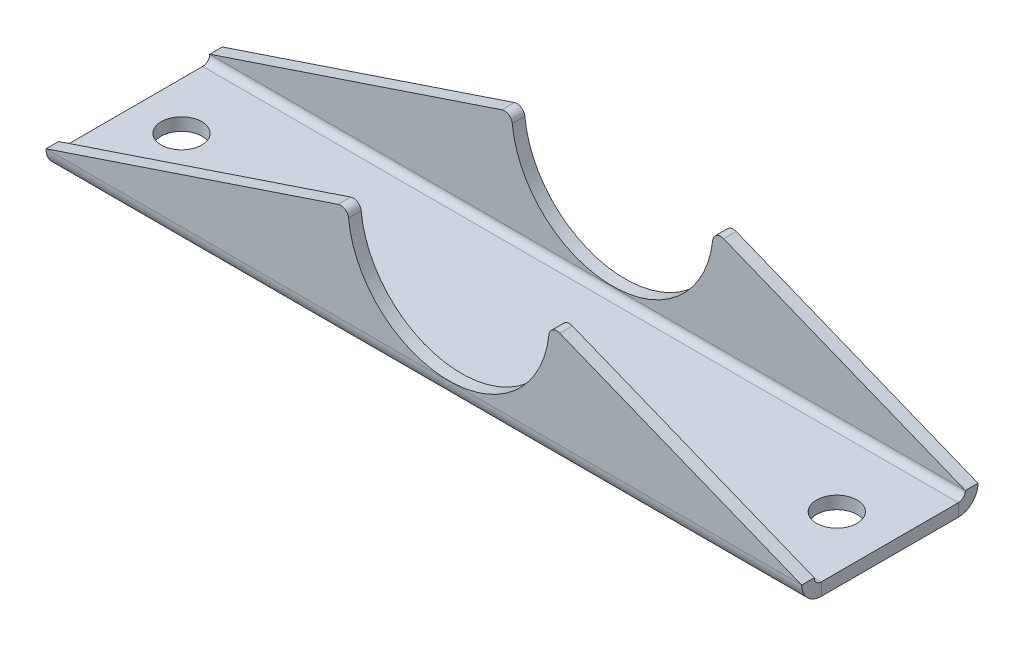
ISO-10303-21;
HEADER;
FILE_DESCRIPTION(('STEP AP214'),'2;1');
FILE_NAME('part.step','',(''),(''),'','','');
FILE_SCHEMA(('AUTOMOTIVE_DESIGN { 1 0 10303 214 1 1 1 1 }'));
ENDSEC;
DATA;
#1=APPLICATION_CONTEXT('core data for automotive mechanical design processes');
#2=APPLICATION_PROTOCOL_DEFINITION('international standard','automotive_design',2000,#1);
#3=PRODUCT_CONTEXT('',#1,'mechanical');
#4=PRODUCT('Part','Part','',(#3));
#5=PRODUCT_RELATED_PRODUCT_CATEGORY('part','',(#4));
#6=PRODUCT_DEFINITION_FORMATION('','',#4);
#7=PRODUCT_DEFINITION_CONTEXT('part definition',#1,'design');
#8=PRODUCT_DEFINITION('design','',#6,#7);
#9=PRODUCT_DEFINITION_SHAPE('','',#8);
#10=(LENGTH_UNIT() NAMED_UNIT(*) SI_UNIT(.MILLI.,.METRE.));
#11=(NAMED_UNIT(*) PLANE_ANGLE_UNIT() SI_UNIT($,.RADIAN.));
#12=(NAMED_UNIT(*) SI_UNIT($,.STERADIAN.) SOLID_ANGLE_UNIT());
#13=UNCERTAINTY_MEASURE_WITH_UNIT(LENGTH_MEASURE(1.E-05),#10,'distance_accuracy_value','');
#14=(GEOMETRIC_REPRESENTATION_CONTEXT(3) GLOBAL_UNCERTAINTY_ASSIGNED_CONTEXT((#13)) GLOBAL_UNIT_ASSIGNED_CONTEXT((#10,
#11,#12)) REPRESENTATION_CONTEXT('',''));
#15=CARTESIAN_POINT('',(0.,0.,0.));
#16=DIRECTION('',(0.,0.,1.));
#17=DIRECTION('',(1.,0.,0.));
#18=AXIS2_PLACEMENT_3D('',#15,#16,#17);
#19=CARTESIAN_POINT('',(0.,0.,11.1125));
#20=DIRECTION('',(0.,0.,-1.));
#21=DIRECTION('',(-1.,0.,0.));
#22=AXIS2_PLACEMENT_3D('',#19,#20,#21);
#23=PLANE('',#22);
#24=CARTESIAN_POINT('',(3.14739827064426,13.6525,11.1125));
#25=DIRECTION('',(0.,0.,1.));
#26=DIRECTION('',(1.,0.,0.));
#27=AXIS2_PLACEMENT_3D('',#24,#25,#26);
#28=CIRCLE('',#27,12.7);
#29=CARTESIAN_POINT('',(-9.48921957976562,12.385263122892,11.1125));
#30=VERTEX_POINT('',#29);
#31=CARTESIAN_POINT('',(15.7762175173427,12.3097697835311,11.1125));
#32=VERTEX_POINT('',#31);
#33=EDGE_CURVE('E322',#30,#32,#28,.T.);
#34=ORIENTED_EDGE('',*,*,#33,.F.);
#35=CARTESIAN_POINT('',(-10.4842288593254,12.2854806916236,11.1125));
#36=DIRECTION('',(0.,0.,-1.));
#37=DIRECTION('',(-1.,0.,0.));
#38=AXIS2_PLACEMENT_3D('',#35,#36,#37);
#39=CIRCLE('',#38,1.);
#40=CARTESIAN_POINT('',(-10.8020856125828,13.2336194390697,11.1125));
#41=VERTEX_POINT('',#40);
#42=EDGE_CURVE('E349',#30,#41,#39,.F.);
#43=ORIENTED_EDGE('',*,*,#42,.T.);
#44=DIRECTION('',(0.948138747446112,0.317856753257371,0.));
#45=VECTOR('',#44,1.);
#46=CARTESIAN_POINT('',(-5.07961258320421,15.1520377113116,11.1125));
#47=LINE('',#46,#45);
#48=CARTESIAN_POINT('',(-47.625,0.888999999999997,11.1125));
#49=VERTEX_POINT('',#48);
#50=EDGE_CURVE('E369',#49,#41,#47,.T.);
#51=ORIENTED_EDGE('',*,*,#50,.F.);
#52=DIRECTION('',(-1.,0.,0.));
#53=VECTOR('',#52,1.);
#54=CARTESIAN_POINT('',(0.,0.888999999999997,11.1125));
#55=LINE('',#54,#53);
#56=CARTESIAN_POINT('',(47.625,0.888999999999997,11.1125));
#57=VERTEX_POINT('',#56);
#58=EDGE_CURVE('E282',#57,#49,#55,.T.);
#59=ORIENTED_EDGE('',*,*,#58,.F.);
#60=DIRECTION('',(-0.927947517123265,0.372710887236701,0.));
#61=VECTOR('',#60,1.);
#62=CARTESIAN_POINT('',(6.92321704586757,17.2369047651089,11.1125));
#63=LINE('',#62,#61);
#64=CARTESIAN_POINT('',(17.1433236208549,13.131990511956,11.1125));
#65=VERTEX_POINT('',#64);
#66=EDGE_CURVE('E386',#57,#65,#63,.T.);
#67=ORIENTED_EDGE('',*,*,#66,.T.);
#68=CARTESIAN_POINT('',(16.7706127336182,12.2040429948327,11.1125));
#69=DIRECTION('',(0.,0.,-1.));
#70=DIRECTION('',(-1.,0.,0.));
#71=AXIS2_PLACEMENT_3D('',#68,#69,#70);
#72=CIRCLE('',#71,1.);
#73=EDGE_CURVE('E347',#65,#32,#72,.F.);
#74=ORIENTED_EDGE('',*,*,#73,.T.);
#75=EDGE_LOOP('',(#34,#43,#51,#59,#67,#74));
#76=FACE_BOUND('',#75,.T.);
#77=ADVANCED_FACE('F105',(#76),#23,.F.);
#78=CARTESIAN_POINT('',(0.,0.,9.525));
#79=DIRECTION('',(0.,0.,-1.));
#80=DIRECTION('',(-1.,0.,0.));
#81=AXIS2_PLACEMENT_3D('',#78,#79,#80);
#82=PLANE('',#81);
#83=DIRECTION('',(0.948138747446112,0.317856753257371,0.));
#84=VECTOR('',#83,1.);
#85=CARTESIAN_POINT('',(-5.07961258320421,15.1520377113116,9.525));
#86=LINE('',#85,#84);
#87=CARTESIAN_POINT('',(-47.625,0.888999999999997,9.52499999999999));
#88=VERTEX_POINT('',#87);
#89=CARTESIAN_POINT('',(-10.8020856125828,13.2336194390697,9.525));
#90=VERTEX_POINT('',#89);
#91=EDGE_CURVE('E356',#88,#90,#86,.T.);
#92=ORIENTED_EDGE('',*,*,#91,.T.);
#93=CARTESIAN_POINT('',(-10.4842288593254,12.2854806916236,9.525));
#94=DIRECTION('',(0.,0.,-1.));
#95=DIRECTION('',(-1.,0.,0.));
#96=AXIS2_PLACEMENT_3D('',#93,#94,#95);
#97=CIRCLE('',#96,1.);
#98=CARTESIAN_POINT('',(-9.48921957976562,12.385263122892,9.525));
#99=VERTEX_POINT('',#98);
#100=EDGE_CURVE('E113',#90,#99,#97,.T.);
#101=ORIENTED_EDGE('',*,*,#100,.T.);
#102=CARTESIAN_POINT('',(3.14739827064426,13.6525,9.525));
#103=DIRECTION('',(0.,0.,-1.));
#104=DIRECTION('',(-1.,0.,0.));
#105=AXIS2_PLACEMENT_3D('',#102,#103,#104);
#106=CIRCLE('',#105,12.7);
#107=CARTESIAN_POINT('',(15.7762175173427,12.3097697835311,9.525));
#108=VERTEX_POINT('',#107);
#109=EDGE_CURVE('E325',#108,#99,#106,.T.);
#110=ORIENTED_EDGE('',*,*,#109,.F.);
#111=CARTESIAN_POINT('',(16.7706127336182,12.2040429948327,9.525));
#112=DIRECTION('',(0.,0.,-1.));
#113=DIRECTION('',(-1.,0.,0.));
#114=AXIS2_PLACEMENT_3D('',#111,#112,#113);
#115=CIRCLE('',#114,1.);
#116=CARTESIAN_POINT('',(17.1433236208549,13.131990511956,9.525));
#117=VERTEX_POINT('',#116);
#118=EDGE_CURVE('E120',#108,#117,#115,.T.);
#119=ORIENTED_EDGE('',*,*,#118,.T.);
#120=DIRECTION('',(-0.927947517123265,0.372710887236701,0.));
#121=VECTOR('',#120,1.);
#122=CARTESIAN_POINT('',(6.92321704586757,17.2369047651089,9.525));
#123=LINE('',#122,#121);
#124=CARTESIAN_POINT('',(47.625,0.888999999999997,9.52499999999999));
#125=VERTEX_POINT('',#124);
#126=EDGE_CURVE('E388',#125,#117,#123,.T.);
#127=ORIENTED_EDGE('',*,*,#126,.F.);
#128=DIRECTION('',(1.,0.,0.));
#129=VECTOR('',#128,1.);
#130=CARTESIAN_POINT('',(-47.6249999999999,0.888999999999997,9.525));
#131=LINE('',#130,#129);
#132=EDGE_CURVE('E276',#88,#125,#131,.T.);
#133=ORIENTED_EDGE('',*,*,#132,.F.);
#134=EDGE_LOOP('',(#92,#101,#110,#119,#127,#133));
#135=FACE_BOUND('',#134,.T.);
#136=ADVANCED_FACE('F354',(#135),#82,.T.);
#137=CARTESIAN_POINT('',(0.,0.,-11.1125));
#138=DIRECTION('',(0.,0.,1.));
#139=DIRECTION('',(0.,-1.,0.));
#140=AXIS2_PLACEMENT_3D('',#137,#138,#139);
#141=PLANE('',#140);
#142=DIRECTION('',(-0.948138747446112,-0.317856753257371,0.));
#143=VECTOR('',#142,1.);
#144=CARTESIAN_POINT('',(-5.07961258320421,15.1520377113116,-11.1125000000001));
#145=LINE('',#144,#143);
#146=CARTESIAN_POINT('',(-10.8020856125828,13.2336194390697,-11.1125000000001));
#147=VERTEX_POINT('',#146);
#148=CARTESIAN_POINT('',(-47.625,0.888999999999997,-11.1125000000001));
#149=VERTEX_POINT('',#148);
#150=EDGE_CURVE('E221',#147,#149,#145,.T.);
#151=ORIENTED_EDGE('',*,*,#150,.F.);
#152=CARTESIAN_POINT('',(-10.4842288593254,12.2854806916236,-11.1125));
#153=DIRECTION('',(0.,0.,1.));
#154=DIRECTION('',(0.,-1.,0.));
#155=AXIS2_PLACEMENT_3D('',#152,#153,#154);
#156=CIRCLE('',#155,1.);
#157=CARTESIAN_POINT('',(-9.48921957976562,12.385263122892,-11.1125000000001));
#158=VERTEX_POINT('',#157);
#159=EDGE_CURVE('E337',#147,#158,#156,.F.);
#160=ORIENTED_EDGE('',*,*,#159,.T.);
#161=CARTESIAN_POINT('',(3.14739827064426,13.6525,-11.1125000000001));
#162=DIRECTION('',(0.,0.,1.));
#163=DIRECTION('',(1.,0.,0.));
#164=AXIS2_PLACEMENT_3D('',#161,#162,#163);
#165=CIRCLE('',#164,12.7);
#166=CARTESIAN_POINT('',(15.7762175173427,12.3097697835311,-11.1125000000001));
#167=VERTEX_POINT('',#166);
#168=EDGE_CURVE('E396',#158,#167,#165,.T.);
#169=ORIENTED_EDGE('',*,*,#168,.T.);
#170=CARTESIAN_POINT('',(16.7706127336182,12.2040429948327,-11.1125));
#171=DIRECTION('',(0.,0.,1.));
#172=DIRECTION('',(0.,-1.,0.));
#173=AXIS2_PLACEMENT_3D('',#170,#171,#172);
#174=CIRCLE('',#173,1.);
#175=CARTESIAN_POINT('',(17.1433236208549,13.131990511956,-11.1125000000001));
#176=VERTEX_POINT('',#175);
#177=EDGE_CURVE('E335',#167,#176,#174,.F.);
#178=ORIENTED_EDGE('',*,*,#177,.T.);
#179=DIRECTION('',(0.927947517123265,-0.372710887236701,0.));
#180=VECTOR('',#179,1.);
#181=CARTESIAN_POINT('',(6.92321704586757,17.2369047651089,-11.1125000000001));
#182=LINE('',#181,#180);
#183=CARTESIAN_POINT('',(47.625,0.888999999999997,-11.1125000000001));
#184=VERTEX_POINT('',#183);
#185=EDGE_CURVE('E234',#176,#184,#182,.T.);
#186=ORIENTED_EDGE('',*,*,#185,.T.);
#187=DIRECTION('',(1.,0.,0.));
#188=VECTOR('',#187,1.);
#189=CARTESIAN_POINT('',(0.,0.889000000000008,-11.1125));
#190=LINE('',#189,#188);
#191=EDGE_CURVE('E241',#149,#184,#190,.T.);
#192=ORIENTED_EDGE('',*,*,#191,.F.);
#193=EDGE_LOOP('',(#151,#160,#169,#178,#186,#192));
#194=FACE_BOUND('',#193,.T.);
#195=ADVANCED_FACE('F255',(#194),#141,.F.);
#196=CARTESIAN_POINT('',(0.,0.,-9.525));
#197=DIRECTION('',(0.,0.,1.));
#198=DIRECTION('',(0.,-1.,0.));
#199=AXIS2_PLACEMENT_3D('',#196,#197,#198);
#200=PLANE('',#199);
#201=CARTESIAN_POINT('',(3.14739827064426,13.6525,-9.52500000000005));
#202=DIRECTION('',(0.,0.,1.));
#203=DIRECTION('',(0.,-1.,0.));
#204=AXIS2_PLACEMENT_3D('',#201,#202,#203);
#205=CIRCLE('',#204,12.7);
#206=CARTESIAN_POINT('',(-9.48921957976562,12.385263122892,-9.52500000000004));
#207=VERTEX_POINT('',#206);
#208=CARTESIAN_POINT('',(15.7762175173427,12.3097697835311,-9.52500000000004));
#209=VERTEX_POINT('',#208);
#210=EDGE_CURVE('E363',#207,#209,#205,.T.);
#211=ORIENTED_EDGE('',*,*,#210,.F.);
#212=CARTESIAN_POINT('',(-10.4842288593254,12.2854806916236,-9.52500000000004));
#213=DIRECTION('',(0.,0.,1.));
#214=DIRECTION('',(0.,-1.,0.));
#215=AXIS2_PLACEMENT_3D('',#212,#213,#214);
#216=CIRCLE('',#215,1.);
#217=CARTESIAN_POINT('',(-10.8020856125828,13.2336194390697,-9.52500000000005));
#218=VERTEX_POINT('',#217);
#219=EDGE_CURVE('E332',#207,#218,#216,.T.);
#220=ORIENTED_EDGE('',*,*,#219,.T.);
#221=DIRECTION('',(-0.948138747446112,-0.317856753257371,0.));
#222=VECTOR('',#221,1.);
#223=CARTESIAN_POINT('',(-5.07961258320422,15.1520377113116,-9.52500000000005));
#224=LINE('',#223,#222);
#225=CARTESIAN_POINT('',(-47.625,0.888999999999997,-9.52500000000003));
#226=VERTEX_POINT('',#225);
#227=EDGE_CURVE('E373',#218,#226,#224,.T.);
#228=ORIENTED_EDGE('',*,*,#227,.T.);
#229=DIRECTION('',(-1.,0.,0.));
#230=VECTOR('',#229,1.);
#231=CARTESIAN_POINT('',(47.6250000000001,0.888999999999997,-9.52500000000001));
#232=LINE('',#231,#230);
#233=CARTESIAN_POINT('',(47.625,0.888999999999997,-9.52500000000003));
#234=VERTEX_POINT('',#233);
#235=EDGE_CURVE('E253',#234,#226,#232,.T.);
#236=ORIENTED_EDGE('',*,*,#235,.F.);
#237=DIRECTION('',(0.927947517123265,-0.372710887236701,0.));
#238=VECTOR('',#237,1.);
#239=CARTESIAN_POINT('',(6.92321704586757,17.2369047651089,-9.52500000000006));
#240=LINE('',#239,#238);
#241=CARTESIAN_POINT('',(17.1433236208549,13.131990511956,-9.52500000000005));
#242=VERTEX_POINT('',#241);
#243=EDGE_CURVE('E233',#242,#234,#240,.T.);
#244=ORIENTED_EDGE('',*,*,#243,.F.);
#245=CARTESIAN_POINT('',(16.7706127336182,12.2040429948327,-9.52500000000004));
#246=DIRECTION('',(0.,0.,1.));
#247=DIRECTION('',(0.,-1.,0.));
#248=AXIS2_PLACEMENT_3D('',#245,#246,#247);
#249=CIRCLE('',#248,1.);
#250=EDGE_CURVE('E330',#242,#209,#249,.T.);
#251=ORIENTED_EDGE('',*,*,#250,.T.);
#252=EDGE_LOOP('',(#211,#220,#228,#236,#244,#251));
#253=FACE_BOUND('',#252,.T.);
#254=ADVANCED_FACE('F385',(#253),#200,.T.);
#255=CARTESIAN_POINT('',(0.,-1.5875,0.));
#256=DIRECTION('',(0.,-1.,0.));
#257=DIRECTION('',(0.,0.,-1.));
#258=AXIS2_PLACEMENT_3D('',#255,#256,#257);
#259=PLANE('',#258);
#260=CARTESIAN_POINT('',(-41.6560000000016,-1.5875,1.69309011255336E-12));
#261=DIRECTION('',(0.,1.,0.));
#262=DIRECTION('',(0.,0.,1.));
#263=AXIS2_PLACEMENT_3D('',#260,#261,#262);
#264=CIRCLE('',#263,2.552700000002);
#265=CARTESIAN_POINT('',(-41.6560000000016,-1.5875,2.5527000000037));
#266=VERTEX_POINT('',#265);
#267=EDGE_CURVE('E399',#266,#266,#264,.T.);
#268=ORIENTED_EDGE('',*,*,#267,.T.);
#269=EDGE_LOOP('',(#268));
#270=FACE_BOUND('',#269,.T.);
#271=CARTESIAN_POINT('',(40.9409761952181,-1.5875,1.69309011255336E-12));
#272=DIRECTION('',(0.,1.,0.));
#273=DIRECTION('',(0.,0.,1.));
#274=AXIS2_PLACEMENT_3D('',#271,#272,#273);
#275=CIRCLE('',#274,2.55270000000194);
#276=CARTESIAN_POINT('',(40.9409761952181,-1.5875,2.55270000000364));
#277=VERTEX_POINT('',#276);
#278=EDGE_CURVE('E400',#277,#277,#275,.T.);
#279=ORIENTED_EDGE('',*,*,#278,.T.);
#280=EDGE_LOOP('',(#279));
#281=FACE_BOUND('',#280,.T.);
#282=DIRECTION('',(0.,0.,1.));
#283=VECTOR('',#282,1.);
#284=CARTESIAN_POINT('',(-47.625,-1.5875,9.525));
#285=LINE('',#284,#283);
#286=CARTESIAN_POINT('',(-47.6249999999999,-1.58750000000001,-8.636));
#287=VERTEX_POINT('',#286);
#288=CARTESIAN_POINT('',(-47.625,-1.5875,8.636));
#289=VERTEX_POINT('',#288);
#290=EDGE_CURVE('E313',#287,#289,#285,.T.);
#291=ORIENTED_EDGE('',*,*,#290,.F.);
#292=DIRECTION('',(-1.,0.,0.));
#293=VECTOR('',#292,1.);
#294=CARTESIAN_POINT('',(-47.625,-1.58750000000001,-8.636));
#295=LINE('',#294,#293);
#296=CARTESIAN_POINT('',(47.625,-1.5875,-8.636));
#297=VERTEX_POINT('',#296);
#298=EDGE_CURVE('E244',#287,#297,#295,.F.);
#299=ORIENTED_EDGE('',*,*,#298,.T.);
#300=DIRECTION('',(0.,0.,-1.));
#301=VECTOR('',#300,1.);
#302=CARTESIAN_POINT('',(47.625,-1.5875,9.525));
#303=LINE('',#302,#301);
#304=CARTESIAN_POINT('',(47.6250000000001,-1.5875,8.636));
#305=VERTEX_POINT('',#304);
#306=EDGE_CURVE('E310',#305,#297,#303,.T.);
#307=ORIENTED_EDGE('',*,*,#306,.F.);
#308=DIRECTION('',(1.,0.,0.));
#309=VECTOR('',#308,1.);
#310=CARTESIAN_POINT('',(47.6250000000001,-1.5875,8.636));
#311=LINE('',#310,#309);
#312=EDGE_CURVE('E287',#305,#289,#311,.F.);
#313=ORIENTED_EDGE('',*,*,#312,.T.);
#314=EDGE_LOOP('',(#291,#299,#307,#313));
#315=FACE_BOUND('',#314,.T.);
#316=ADVANCED_FACE('F412',(#270,#281,#315),#259,.T.);
#317=CARTESIAN_POINT('',(0.,0.,0.));
#318=DIRECTION('',(0.,-1.,0.));
#319=DIRECTION('',(0.,0.,-1.));
#320=AXIS2_PLACEMENT_3D('',#317,#318,#319);
#321=PLANE('',#320);
#322=CARTESIAN_POINT('',(-41.6560000000016,0.,1.69309011255336E-12));
#323=DIRECTION('',(0.,1.,0.));
#324=DIRECTION('',(0.,0.,1.));
#325=AXIS2_PLACEMENT_3D('',#322,#323,#324);
#326=CIRCLE('',#325,2.552700000002);
#327=CARTESIAN_POINT('',(-41.6560000000016,0.,2.5527000000037));
#328=VERTEX_POINT('',#327);
#329=EDGE_CURVE('E406',#328,#328,#326,.T.);
#330=ORIENTED_EDGE('',*,*,#329,.F.);
#331=EDGE_LOOP('',(#330));
#332=FACE_BOUND('',#331,.T.);
#333=CARTESIAN_POINT('',(40.9409761952181,0.,1.69309011255336E-12));
#334=DIRECTION('',(0.,1.,0.));
#335=DIRECTION('',(0.,0.,1.));
#336=AXIS2_PLACEMENT_3D('',#333,#334,#335);
#337=CIRCLE('',#336,2.55270000000194);
#338=CARTESIAN_POINT('',(40.9409761952181,0.,2.55270000000364));
#339=VERTEX_POINT('',#338);
#340=EDGE_CURVE('E403',#339,#339,#337,.T.);
#341=ORIENTED_EDGE('',*,*,#340,.F.);
#342=EDGE_LOOP('',(#341));
#343=FACE_BOUND('',#342,.T.);
#344=DIRECTION('',(-1.,0.,0.));
#345=VECTOR('',#344,1.);
#346=CARTESIAN_POINT('',(-47.625,0.,-8.636));
#347=LINE('',#346,#345);
#348=CARTESIAN_POINT('',(-47.6249999999999,0.,-8.636));
#349=VERTEX_POINT('',#348);
#350=CARTESIAN_POINT('',(47.625,0.,-8.636));
#351=VERTEX_POINT('',#350);
#352=EDGE_CURVE('E259',#349,#351,#347,.F.);
#353=ORIENTED_EDGE('',*,*,#352,.F.);
#354=DIRECTION('',(0.,0.,1.));
#355=VECTOR('',#354,1.);
#356=CARTESIAN_POINT('',(-47.625,0.,9.525));
#357=LINE('',#356,#355);
#358=CARTESIAN_POINT('',(-47.625,0.,8.636));
#359=VERTEX_POINT('',#358);
#360=EDGE_CURVE('E314',#349,#359,#357,.T.);
#361=ORIENTED_EDGE('',*,*,#360,.T.);
#362=DIRECTION('',(1.,0.,0.));
#363=VECTOR('',#362,1.);
#364=CARTESIAN_POINT('',(47.6250000000001,0.,8.636));
#365=LINE('',#364,#363);
#366=CARTESIAN_POINT('',(47.6250000000001,0.,8.636));
#367=VERTEX_POINT('',#366);
#368=EDGE_CURVE('E300',#367,#359,#365,.F.);
#369=ORIENTED_EDGE('',*,*,#368,.F.);
#370=DIRECTION('',(0.,0.,-1.));
#371=VECTOR('',#370,1.);
#372=CARTESIAN_POINT('',(47.625,0.,9.525));
#373=LINE('',#372,#371);
#374=EDGE_CURVE('E307',#367,#351,#373,.T.);
#375=ORIENTED_EDGE('',*,*,#374,.T.);
#376=EDGE_LOOP('',(#353,#361,#369,#375));
#377=FACE_BOUND('',#376,.T.);
#378=ADVANCED_FACE('F423',(#332,#343,#377),#321,.F.);
#379=CARTESIAN_POINT('',(-47.625,-1.5875,9.525));
#380=DIRECTION('',(-1.,0.,0.));
#381=DIRECTION('',(0.,0.,1.));
#382=AXIS2_PLACEMENT_3D('',#379,#380,#381);
#383=PLANE('',#382);
#384=ORIENTED_EDGE('',*,*,#360,.F.);
#385=DIRECTION('',(0.,-1.,0.));
#386=VECTOR('',#385,1.);
#387=CARTESIAN_POINT('',(-47.6249999999999,0.,-8.636));
#388=LINE('',#387,#386);
#389=EDGE_CURVE('E266',#349,#287,#388,.T.);
#390=ORIENTED_EDGE('',*,*,#389,.T.);
#391=ORIENTED_EDGE('',*,*,#290,.T.);
#392=DIRECTION('',(0.,-1.,0.));
#393=VECTOR('',#392,1.);
#394=CARTESIAN_POINT('',(-47.625,0.,8.636));
#395=LINE('',#394,#393);
#396=EDGE_CURVE('E304',#359,#289,#395,.T.);
#397=ORIENTED_EDGE('',*,*,#396,.F.);
#398=EDGE_LOOP('',(#384,#390,#391,#397));
#399=FACE_BOUND('',#398,.T.);
#400=ADVANCED_FACE('F426',(#399),#383,.T.);
#401=CARTESIAN_POINT('',(47.625,-1.5875,9.525));
#402=DIRECTION('',(1.,0.,0.));
#403=DIRECTION('',(0.,0.,-1.));
#404=AXIS2_PLACEMENT_3D('',#401,#402,#403);
#405=PLANE('',#404);
#406=DIRECTION('',(0.,-1.,0.));
#407=VECTOR('',#406,1.);
#408=CARTESIAN_POINT('',(47.625,0.,-8.636));
#409=LINE('',#408,#407);
#410=EDGE_CURVE('E271',#351,#297,#409,.T.);
#411=ORIENTED_EDGE('',*,*,#410,.F.);
#412=ORIENTED_EDGE('',*,*,#374,.F.);
#413=DIRECTION('',(0.,-1.,0.));
#414=VECTOR('',#413,1.);
#415=CARTESIAN_POINT('',(47.6250000000001,0.,8.636));
#416=LINE('',#415,#414);
#417=EDGE_CURVE('E294',#367,#305,#416,.T.);
#418=ORIENTED_EDGE('',*,*,#417,.T.);
#419=ORIENTED_EDGE('',*,*,#306,.T.);
#420=EDGE_LOOP('',(#411,#412,#418,#419));
#421=FACE_BOUND('',#420,.T.);
#422=ADVANCED_FACE('F453',(#421),#405,.T.);
#423=CARTESIAN_POINT('',(-47.625,0.888999999999997,8.636));
#424=DIRECTION('',(-1.,0.,0.));
#425=DIRECTION('',(0.,0.,1.));
#426=AXIS2_PLACEMENT_3D('',#423,#424,#425);
#427=PLANE('',#426);
#428=DIRECTION('',(0.,0.,1.));
#429=VECTOR('',#428,1.);
#430=CARTESIAN_POINT('',(-47.6249999999999,0.888999999999997,9.525));
#431=LINE('',#430,#429);
#432=EDGE_CURVE('E274',#88,#49,#431,.T.);
#433=ORIENTED_EDGE('',*,*,#432,.F.);
#434=CARTESIAN_POINT('',(-47.625,0.888999999999997,8.636));
#435=DIRECTION('',(1.,0.,0.));
#436=DIRECTION('',(0.,0.,-1.));
#437=AXIS2_PLACEMENT_3D('',#434,#435,#436);
#438=CIRCLE('',#437,0.888999999999999);
#439=EDGE_CURVE('E297',#359,#88,#438,.F.);
#440=ORIENTED_EDGE('',*,*,#439,.F.);
#441=ORIENTED_EDGE('',*,*,#396,.T.);
#442=CARTESIAN_POINT('',(-47.625,0.888999999999997,8.636));
#443=DIRECTION('',(1.,0.,0.));
#444=DIRECTION('',(0.,0.,-1.));
#445=AXIS2_PLACEMENT_3D('',#442,#443,#444);
#446=CIRCLE('',#445,2.4765);
#447=EDGE_CURVE('E290',#289,#49,#446,.F.);
#448=ORIENTED_EDGE('',*,*,#447,.T.);
#449=EDGE_LOOP('',(#433,#440,#441,#448));
#450=FACE_BOUND('',#449,.T.);
#451=ADVANCED_FACE('F438',(#450),#427,.T.);
#452=CARTESIAN_POINT('',(47.6250000000001,0.888999999999997,8.636));
#453=DIRECTION('',(-1.,0.,0.));
#454=DIRECTION('',(0.,0.,1.));
#455=AXIS2_PLACEMENT_3D('',#452,#453,#454);
#456=PLANE('',#455);
#457=CARTESIAN_POINT('',(47.6250000000001,0.888999999999997,8.636));
#458=DIRECTION('',(1.,0.,0.));
#459=DIRECTION('',(0.,0.,-1.));
#460=AXIS2_PLACEMENT_3D('',#457,#458,#459);
#461=CIRCLE('',#460,0.888999999999999);
#462=EDGE_CURVE('E286',#125,#367,#461,.T.);
#463=ORIENTED_EDGE('',*,*,#462,.F.);
#464=DIRECTION('',(0.,0.,1.));
#465=VECTOR('',#464,1.);
#466=CARTESIAN_POINT('',(47.6250000000001,0.888999999999997,9.525));
#467=LINE('',#466,#465);
#468=EDGE_CURVE('E279',#125,#57,#467,.T.);
#469=ORIENTED_EDGE('',*,*,#468,.T.);
#470=CARTESIAN_POINT('',(47.6250000000001,0.888999999999997,8.636));
#471=DIRECTION('',(1.,0.,0.));
#472=DIRECTION('',(0.,0.,-1.));
#473=AXIS2_PLACEMENT_3D('',#470,#471,#472);
#474=CIRCLE('',#473,2.4765);
#475=EDGE_CURVE('E291',#57,#305,#474,.T.);
#476=ORIENTED_EDGE('',*,*,#475,.T.);
#477=ORIENTED_EDGE('',*,*,#417,.F.);
#478=EDGE_LOOP('',(#463,#469,#476,#477));
#479=FACE_BOUND('',#478,.T.);
#480=ADVANCED_FACE('F450',(#479),#456,.F.);
#481=CARTESIAN_POINT('',(47.6250000000001,0.888999999999997,8.636));
#482=DIRECTION('',(1.,0.,0.));
#483=DIRECTION('',(0.,0.,1.));
#484=AXIS2_PLACEMENT_3D('',#481,#482,#483);
#485=CYLINDRICAL_SURFACE('',#484,2.4765);
#486=ORIENTED_EDGE('',*,*,#312,.F.);
#487=ORIENTED_EDGE('',*,*,#475,.F.);
#488=ORIENTED_EDGE('',*,*,#58,.T.);
#489=ORIENTED_EDGE('',*,*,#447,.F.);
#490=EDGE_LOOP('',(#486,#487,#488,#489));
#491=FACE_BOUND('',#490,.T.);
#492=ADVANCED_FACE('F448',(#491),#485,.T.);
#493=CARTESIAN_POINT('',(47.6250000000001,0.888999999999997,8.636));
#494=DIRECTION('',(1.,0.,0.));
#495=DIRECTION('',(0.,0.,1.));
#496=AXIS2_PLACEMENT_3D('',#493,#494,#495);
#497=CYLINDRICAL_SURFACE('',#496,0.888999999999999);
#498=ORIENTED_EDGE('',*,*,#368,.T.);
#499=ORIENTED_EDGE('',*,*,#439,.T.);
#500=ORIENTED_EDGE('',*,*,#132,.T.);
#501=ORIENTED_EDGE('',*,*,#462,.T.);
#502=EDGE_LOOP('',(#498,#499,#500,#501));
#503=FACE_BOUND('',#502,.T.);
#504=ADVANCED_FACE('F440',(#503),#497,.F.);
#505=CARTESIAN_POINT('',(47.625,0.888999999999991,-8.636));
#506=DIRECTION('',(1.,0.,0.));
#507=DIRECTION('',(0.,0.,-1.));
#508=AXIS2_PLACEMENT_3D('',#505,#506,#507);
#509=PLANE('',#508);
#510=DIRECTION('',(0.,0.,-1.));
#511=VECTOR('',#510,1.);
#512=CARTESIAN_POINT('',(47.6250000000001,0.888999999999997,-9.52500000000001));
#513=LINE('',#512,#511);
#514=EDGE_CURVE('E263',#234,#184,#513,.T.);
#515=ORIENTED_EDGE('',*,*,#514,.F.);
#516=CARTESIAN_POINT('',(47.625,0.888999999999991,-8.636));
#517=DIRECTION('',(-1.,0.,0.));
#518=DIRECTION('',(0.,0.,1.));
#519=AXIS2_PLACEMENT_3D('',#516,#517,#518);
#520=CIRCLE('',#519,0.889000000000001);
#521=EDGE_CURVE('E247',#351,#234,#520,.F.);
#522=ORIENTED_EDGE('',*,*,#521,.F.);
#523=ORIENTED_EDGE('',*,*,#410,.T.);
#524=CARTESIAN_POINT('',(47.625,0.888999999999991,-8.636));
#525=DIRECTION('',(-1.,0.,0.));
#526=DIRECTION('',(0.,0.,1.));
#527=AXIS2_PLACEMENT_3D('',#524,#525,#526);
#528=CIRCLE('',#527,2.4765);
#529=EDGE_CURVE('E265',#297,#184,#528,.F.);
#530=ORIENTED_EDGE('',*,*,#529,.T.);
#531=EDGE_LOOP('',(#515,#522,#523,#530));
#532=FACE_BOUND('',#531,.T.);
#533=ADVANCED_FACE('F457',(#532),#509,.T.);
#534=CARTESIAN_POINT('',(-47.6249999999999,0.888999999999991,-8.636));
#535=DIRECTION('',(1.,0.,0.));
#536=DIRECTION('',(0.,0.,-1.));
#537=AXIS2_PLACEMENT_3D('',#534,#535,#536);
#538=PLANE('',#537);
#539=CARTESIAN_POINT('',(-47.6249999999999,0.888999999999991,-8.636));
#540=DIRECTION('',(-1.,0.,0.));
#541=DIRECTION('',(0.,0.,1.));
#542=AXIS2_PLACEMENT_3D('',#539,#540,#541);
#543=CIRCLE('',#542,0.889000000000001);
#544=EDGE_CURVE('E252',#226,#349,#543,.T.);
#545=ORIENTED_EDGE('',*,*,#544,.F.);
#546=DIRECTION('',(0.,0.,-1.));
#547=VECTOR('',#546,1.);
#548=CARTESIAN_POINT('',(-47.6249999999999,0.888999999999997,-9.52500000000001));
#549=LINE('',#548,#547);
#550=EDGE_CURVE('E226',#226,#149,#549,.T.);
#551=ORIENTED_EDGE('',*,*,#550,.T.);
#552=CARTESIAN_POINT('',(-47.6249999999999,0.888999999999991,-8.636));
#553=DIRECTION('',(-1.,0.,0.));
#554=DIRECTION('',(0.,0.,1.));
#555=AXIS2_PLACEMENT_3D('',#552,#553,#554);
#556=CIRCLE('',#555,2.4765);
#557=EDGE_CURVE('E239',#149,#287,#556,.T.);
#558=ORIENTED_EDGE('',*,*,#557,.T.);
#559=ORIENTED_EDGE('',*,*,#389,.F.);
#560=EDGE_LOOP('',(#545,#551,#558,#559));
#561=FACE_BOUND('',#560,.T.);
#562=ADVANCED_FACE('F250',(#561),#538,.F.);
#563=CARTESIAN_POINT('',(-47.625,0.888999999999991,-8.636));
#564=DIRECTION('',(-1.,0.,0.));
#565=DIRECTION('',(0.,0.,-1.));
#566=AXIS2_PLACEMENT_3D('',#563,#564,#565);
#567=CYLINDRICAL_SURFACE('',#566,2.4765);
#568=ORIENTED_EDGE('',*,*,#298,.F.);
#569=ORIENTED_EDGE('',*,*,#557,.F.);
#570=ORIENTED_EDGE('',*,*,#191,.T.);
#571=ORIENTED_EDGE('',*,*,#529,.F.);
#572=EDGE_LOOP('',(#568,#569,#570,#571));
#573=FACE_BOUND('',#572,.T.);
#574=ADVANCED_FACE('F240',(#573),#567,.T.);
#575=CARTESIAN_POINT('',(-47.625,0.888999999999991,-8.636));
#576=DIRECTION('',(-1.,0.,0.));
#577=DIRECTION('',(0.,0.,-1.));
#578=AXIS2_PLACEMENT_3D('',#575,#576,#577);
#579=CYLINDRICAL_SURFACE('',#578,0.889000000000001);
#580=ORIENTED_EDGE('',*,*,#352,.T.);
#581=ORIENTED_EDGE('',*,*,#521,.T.);
#582=ORIENTED_EDGE('',*,*,#235,.T.);
#583=ORIENTED_EDGE('',*,*,#544,.T.);
#584=EDGE_LOOP('',(#580,#581,#582,#583));
#585=FACE_BOUND('',#584,.T.);
#586=ADVANCED_FACE('F379',(#585),#579,.F.);
#587=CARTESIAN_POINT('',(6.92321704586757,17.2369047651089,-11.1125000000001));
#588=DIRECTION('',(-0.372710887236701,-0.927947517123265,0.));
#589=DIRECTION('',(0.927947517123265,-0.372710887236701,0.));
#590=AXIS2_PLACEMENT_3D('',#587,#588,#589);
#591=PLANE('',#590);
#592=ORIENTED_EDGE('',*,*,#185,.F.);
#593=DIRECTION('',(0.,0.,1.));
#594=VECTOR('',#593,1.);
#595=CARTESIAN_POINT('',(17.1433236208549,13.131990511956,-11.1125000000001));
#596=LINE('',#595,#594);
#597=EDGE_CURVE('E339',#176,#242,#596,.T.);
#598=ORIENTED_EDGE('',*,*,#597,.T.);
#599=ORIENTED_EDGE('',*,*,#243,.T.);
#600=ORIENTED_EDGE('',*,*,#514,.T.);
#601=EDGE_LOOP('',(#592,#598,#599,#600));
#602=FACE_BOUND('',#601,.T.);
#603=ADVANCED_FACE('F521',(#602),#591,.F.);
#604=CARTESIAN_POINT('',(-5.07961258320421,15.1520377113116,-11.1125000000001));
#605=DIRECTION('',(-0.317856753257371,0.948138747446112,0.));
#606=DIRECTION('',(-0.948138747446112,-0.317856753257371,0.));
#607=AXIS2_PLACEMENT_3D('',#604,#605,#606);
#608=PLANE('',#607);
#609=ORIENTED_EDGE('',*,*,#227,.F.);
#610=DIRECTION('',(0.,0.,-1.));
#611=VECTOR('',#610,1.);
#612=CARTESIAN_POINT('',(-10.8020856125828,13.2336194390697,-11.1125000000001));
#613=LINE('',#612,#611);
#614=EDGE_CURVE('E229',#218,#147,#613,.T.);
#615=ORIENTED_EDGE('',*,*,#614,.T.);
#616=ORIENTED_EDGE('',*,*,#150,.T.);
#617=ORIENTED_EDGE('',*,*,#550,.F.);
#618=EDGE_LOOP('',(#609,#615,#616,#617));
#619=FACE_BOUND('',#618,.T.);
#620=ADVANCED_FACE('F224',(#619),#608,.T.);
#621=ORIENTED_EDGE('',*,*,#126,.T.);
#622=DIRECTION('',(0.,0.,1.));
#623=VECTOR('',#622,1.);
#624=CARTESIAN_POINT('',(17.1433236208549,13.131990511956,-11.1125000000001));
#625=LINE('',#624,#623);
#626=EDGE_CURVE('E12',#117,#65,#625,.T.);
#627=ORIENTED_EDGE('',*,*,#626,.T.);
#628=ORIENTED_EDGE('',*,*,#66,.F.);
#629=ORIENTED_EDGE('',*,*,#468,.F.);
#630=EDGE_LOOP('',(#621,#627,#628,#629));
#631=FACE_BOUND('',#630,.T.);
#632=ADVANCED_FACE('F444',(#631),#591,.F.);
#633=ORIENTED_EDGE('',*,*,#50,.T.);
#634=DIRECTION('',(0.,0.,-1.));
#635=VECTOR('',#634,1.);
#636=CARTESIAN_POINT('',(-10.8020856125828,13.2336194390697,9.52499999999999));
#637=LINE('',#636,#635);
#638=EDGE_CURVE('E128',#41,#90,#637,.T.);
#639=ORIENTED_EDGE('',*,*,#638,.T.);
#640=ORIENTED_EDGE('',*,*,#91,.F.);
#641=ORIENTED_EDGE('',*,*,#432,.T.);
#642=EDGE_LOOP('',(#633,#639,#640,#641));
#643=FACE_BOUND('',#642,.T.);
#644=ADVANCED_FACE('F370',(#643),#608,.T.);
#645=CARTESIAN_POINT('',(3.14739827064426,13.6525,-11.1125000000001));
#646=DIRECTION('',(0.,0.,1.));
#647=DIRECTION('',(1.,0.,0.));
#648=AXIS2_PLACEMENT_3D('',#645,#646,#647);
#649=CYLINDRICAL_SURFACE('',#648,12.7);
#650=ORIENTED_EDGE('',*,*,#109,.T.);
#651=DIRECTION('',(0.,0.,1.));
#652=VECTOR('',#651,1.);
#653=CARTESIAN_POINT('',(-9.48921957976562,12.385263122892,-11.1125000000001));
#654=LINE('',#653,#652);
#655=EDGE_CURVE('E344',#99,#30,#654,.T.);
#656=ORIENTED_EDGE('',*,*,#655,.T.);
#657=ORIENTED_EDGE('',*,*,#33,.T.);
#658=DIRECTION('',(0.,0.,1.));
#659=VECTOR('',#658,1.);
#660=CARTESIAN_POINT('',(15.7762175173427,12.3097697835311,-11.1125000000001));
#661=LINE('',#660,#659);
#662=EDGE_CURVE('E342',#32,#108,#661,.F.);
#663=ORIENTED_EDGE('',*,*,#662,.T.);
#664=EDGE_LOOP('',(#650,#656,#657,#663));
#665=FACE_BOUND('',#664,.T.);
#666=ADVANCED_FACE('F360',(#665),#649,.F.);
#667=ORIENTED_EDGE('',*,*,#168,.F.);
#668=DIRECTION('',(0.,0.,1.));
#669=VECTOR('',#668,1.);
#670=CARTESIAN_POINT('',(-9.48921957976562,12.385263122892,-11.1125000000001));
#671=LINE('',#670,#669);
#672=EDGE_CURVE('E327',#158,#207,#671,.T.);
#673=ORIENTED_EDGE('',*,*,#672,.T.);
#674=ORIENTED_EDGE('',*,*,#210,.T.);
#675=DIRECTION('',(0.,0.,1.));
#676=VECTOR('',#675,1.);
#677=CARTESIAN_POINT('',(15.7762175173427,12.3097697835311,-11.1125000000001));
#678=LINE('',#677,#676);
#679=EDGE_CURVE('E317',#209,#167,#678,.F.);
#680=ORIENTED_EDGE('',*,*,#679,.T.);
#681=EDGE_LOOP('',(#667,#673,#674,#680));
#682=FACE_BOUND('',#681,.T.);
#683=ADVANCED_FACE('F594',(#682),#649,.F.);
#684=CARTESIAN_POINT('',(40.9409761952181,-1.5875,1.69309011255336E-12));
#685=DIRECTION('',(0.,1.,0.));
#686=DIRECTION('',(0.,0.,1.));
#687=AXIS2_PLACEMENT_3D('',#684,#685,#686);
#688=CYLINDRICAL_SURFACE('',#687,2.55270000000194);
#689=ORIENTED_EDGE('',*,*,#278,.F.);
#690=EDGE_LOOP('',(#689));
#691=FACE_BOUND('',#690,.T.);
#692=ORIENTED_EDGE('',*,*,#340,.T.);
#693=EDGE_LOOP('',(#692));
#694=FACE_BOUND('',#693,.T.);
#695=ADVANCED_FACE('F419',(#691,#694),#688,.F.);
#696=CARTESIAN_POINT('',(-41.6560000000016,-1.5875,1.69309011255336E-12));
#697=DIRECTION('',(0.,1.,0.));
#698=DIRECTION('',(0.,0.,1.));
#699=AXIS2_PLACEMENT_3D('',#696,#697,#698);
#700=CYLINDRICAL_SURFACE('',#699,2.552700000002);
#701=ORIENTED_EDGE('',*,*,#267,.F.);
#702=EDGE_LOOP('',(#701));
#703=FACE_BOUND('',#702,.T.);
#704=ORIENTED_EDGE('',*,*,#329,.T.);
#705=EDGE_LOOP('',(#704));
#706=FACE_BOUND('',#705,.T.);
#707=ADVANCED_FACE('F415',(#703,#706),#700,.F.);
#708=CARTESIAN_POINT('',(-10.4842288593254,12.2854806916236,-11.1125000000001));
#709=DIRECTION('',(0.,0.,1.));
#710=DIRECTION('',(1.,0.,0.));
#711=AXIS2_PLACEMENT_3D('',#708,#709,#710);
#712=CYLINDRICAL_SURFACE('',#711,1.);
#713=ORIENTED_EDGE('',*,*,#159,.F.);
#714=ORIENTED_EDGE('',*,*,#614,.F.);
#715=ORIENTED_EDGE('',*,*,#219,.F.);
#716=ORIENTED_EDGE('',*,*,#672,.F.);
#717=EDGE_LOOP('',(#713,#714,#715,#716));
#718=FACE_BOUND('',#717,.T.);
#719=ADVANCED_FACE('F418',(#718),#712,.T.);
#720=CARTESIAN_POINT('',(16.7706127336182,12.2040429948327,-11.1125000000001));
#721=DIRECTION('',(0.,0.,1.));
#722=DIRECTION('',(1.,0.,0.));
#723=AXIS2_PLACEMENT_3D('',#720,#721,#722);
#724=CYLINDRICAL_SURFACE('',#723,1.);
#725=ORIENTED_EDGE('',*,*,#177,.F.);
#726=ORIENTED_EDGE('',*,*,#679,.F.);
#727=ORIENTED_EDGE('',*,*,#250,.F.);
#728=ORIENTED_EDGE('',*,*,#597,.F.);
#729=EDGE_LOOP('',(#725,#726,#727,#728));
#730=FACE_BOUND('',#729,.T.);
#731=ADVANCED_FACE('F628',(#730),#724,.T.);
#732=CARTESIAN_POINT('',(-10.4842288593254,12.2854806916236,-11.1125000000001));
#733=DIRECTION('',(0.,0.,1.));
#734=DIRECTION('',(1.,0.,0.));
#735=AXIS2_PLACEMENT_3D('',#732,#733,#734);
#736=CYLINDRICAL_SURFACE('',#735,1.);
#737=ORIENTED_EDGE('',*,*,#100,.F.);
#738=ORIENTED_EDGE('',*,*,#638,.F.);
#739=ORIENTED_EDGE('',*,*,#42,.F.);
#740=ORIENTED_EDGE('',*,*,#655,.F.);
#741=EDGE_LOOP('',(#737,#738,#739,#740));
#742=FACE_BOUND('',#741,.T.);
#743=ADVANCED_FACE('F365',(#742),#736,.T.);
#744=CARTESIAN_POINT('',(16.7706127336182,12.2040429948327,-11.1125000000001));
#745=DIRECTION('',(0.,0.,1.));
#746=DIRECTION('',(1.,0.,0.));
#747=AXIS2_PLACEMENT_3D('',#744,#745,#746);
#748=CYLINDRICAL_SURFACE('',#747,1.);
#749=ORIENTED_EDGE('',*,*,#118,.F.);
#750=ORIENTED_EDGE('',*,*,#662,.F.);
#751=ORIENTED_EDGE('',*,*,#73,.F.);
#752=ORIENTED_EDGE('',*,*,#626,.F.);
#753=EDGE_LOOP('',(#749,#750,#751,#752));
#754=FACE_BOUND('',#753,.T.);
#755=ADVANCED_FACE('F107',(#754),#748,.T.);
#756=CLOSED_SHELL('',(#77,#136,#195,#254,#316,#378,#400,#422,#451,#480,#492,#504,#533,#562,#574,
#586,#603,#620,#632,#644,#666,#683,#695,#707,#719,#731,#743,#755));
#757=MANIFOLD_SOLID_BREP('B2',#756);
#758=ADVANCED_BREP_SHAPE_REPRESENTATION('',(#18,#757),#14);
#759=SHAPE_DEFINITION_REPRESENTATION(#9,#758);
ENDSEC;
END-ISO-10303-21;
